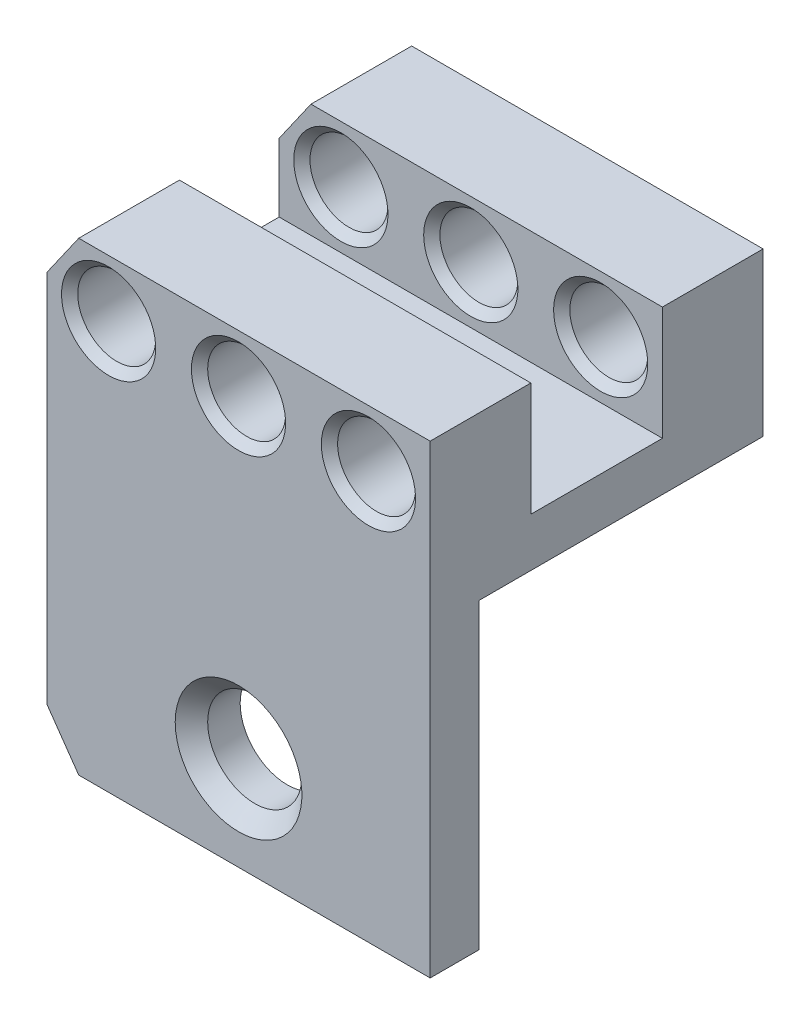
ISO-10303-21;
HEADER;
FILE_DESCRIPTION(('STEP AP214'),'2;1');
FILE_NAME('part.step','',(''),(''),'','','');
FILE_SCHEMA(('AUTOMOTIVE_DESIGN { 1 0 10303 214 1 1 1 1 }'));
ENDSEC;
DATA;
#1=APPLICATION_CONTEXT('core data for automotive mechanical design processes');
#2=APPLICATION_PROTOCOL_DEFINITION('international standard','automotive_design',2000,#1);
#3=PRODUCT_CONTEXT('',#1,'mechanical');
#4=PRODUCT('Part','Part','',(#3));
#5=PRODUCT_RELATED_PRODUCT_CATEGORY('part','',(#4));
#6=PRODUCT_DEFINITION_FORMATION('','',#4);
#7=PRODUCT_DEFINITION_CONTEXT('part definition',#1,'design');
#8=PRODUCT_DEFINITION('design','',#6,#7);
#9=PRODUCT_DEFINITION_SHAPE('','',#8);
#10=(LENGTH_UNIT() NAMED_UNIT(*) SI_UNIT(.MILLI.,.METRE.));
#11=(NAMED_UNIT(*) PLANE_ANGLE_UNIT() SI_UNIT($,.RADIAN.));
#12=(NAMED_UNIT(*) SI_UNIT($,.STERADIAN.) SOLID_ANGLE_UNIT());
#13=UNCERTAINTY_MEASURE_WITH_UNIT(LENGTH_MEASURE(1.E-05),#10,'distance_accuracy_value','');
#14=(GEOMETRIC_REPRESENTATION_CONTEXT(3) GLOBAL_UNCERTAINTY_ASSIGNED_CONTEXT((#13)) GLOBAL_UNIT_ASSIGNED_CONTEXT((#10,
#11,#12)) REPRESENTATION_CONTEXT('',''));
#15=CARTESIAN_POINT('',(0.,0.,0.));
#16=DIRECTION('',(0.,0.,1.));
#17=DIRECTION('',(1.,0.,0.));
#18=AXIS2_PLACEMENT_3D('',#15,#16,#17);
#19=CARTESIAN_POINT('',(0.,3.,0.));
#20=DIRECTION('',(0.,-1.,0.));
#21=DIRECTION('',(1.,0.,0.));
#22=AXIS2_PLACEMENT_3D('',#19,#20,#21);
#23=PLANE('',#22);
#24=DIRECTION('',(1.,0.,0.));
#25=VECTOR('',#24,1.);
#26=CARTESIAN_POINT('',(0.,3.,-11.3));
#27=LINE('',#26,#25);
#28=CARTESIAN_POINT('',(-23.6,3.,-11.3));
#29=VERTEX_POINT('',#28);
#30=CARTESIAN_POINT('',(0.,3.,-11.3));
#31=VERTEX_POINT('',#30);
#32=EDGE_CURVE('E179',#29,#31,#27,.T.);
#33=ORIENTED_EDGE('',*,*,#32,.F.);
#34=DIRECTION('',(0.,0.,1.));
#35=VECTOR('',#34,1.);
#36=CARTESIAN_POINT('',(-23.6,3.,3.));
#37=LINE('',#36,#35);
#38=CARTESIAN_POINT('',(-23.6,3.,-3.2));
#39=VERTEX_POINT('',#38);
#40=EDGE_CURVE('E206',#29,#39,#37,.T.);
#41=ORIENTED_EDGE('',*,*,#40,.T.);
#42=DIRECTION('',(-1.,0.,0.));
#43=VECTOR('',#42,1.);
#44=CARTESIAN_POINT('',(-23.6,3.,-3.2));
#45=LINE('',#44,#43);
#46=CARTESIAN_POINT('',(0.,3.,-3.2));
#47=VERTEX_POINT('',#46);
#48=EDGE_CURVE('E187',#47,#39,#45,.T.);
#49=ORIENTED_EDGE('',*,*,#48,.F.);
#50=DIRECTION('',(0.,0.,-1.));
#51=VECTOR('',#50,1.);
#52=CARTESIAN_POINT('',(0.,3.,-17.5));
#53=LINE('',#52,#51);
#54=EDGE_CURVE('E203',#47,#31,#53,.T.);
#55=ORIENTED_EDGE('',*,*,#54,.T.);
#56=EDGE_LOOP('',(#33,#41,#49,#55));
#57=FACE_BOUND('',#56,.T.);
#58=ADVANCED_FACE('F47',(#57),#23,.F.);
#59=CARTESIAN_POINT('',(0.,0.,3.));
#60=DIRECTION('',(0.,0.,-1.));
#61=DIRECTION('',(-1.,0.,0.));
#62=AXIS2_PLACEMENT_3D('',#59,#60,#61);
#63=PLANE('',#62);
#64=CARTESIAN_POINT('',(-19.8,6.5,3.));
#65=DIRECTION('',(0.,0.,-1.));
#66=DIRECTION('',(-1.,0.,0.));
#67=AXIS2_PLACEMENT_3D('',#64,#65,#66);
#68=CIRCLE('',#67,2.9);
#69=CARTESIAN_POINT('',(-22.7,6.5,3.));
#70=VERTEX_POINT('',#69);
#71=EDGE_CURVE('E11',#70,#70,#68,.T.);
#72=ORIENTED_EDGE('',*,*,#71,.T.);
#73=EDGE_LOOP('',(#72));
#74=FACE_BOUND('',#73,.T.);
#75=CARTESIAN_POINT('',(-11.8,6.5,3.));
#76=DIRECTION('',(0.,0.,-1.));
#77=DIRECTION('',(-1.,0.,0.));
#78=AXIS2_PLACEMENT_3D('',#75,#76,#77);
#79=CIRCLE('',#78,2.9);
#80=CARTESIAN_POINT('',(-14.7,6.5,3.));
#81=VERTEX_POINT('',#80);
#82=EDGE_CURVE('E57',#81,#81,#79,.T.);
#83=ORIENTED_EDGE('',*,*,#82,.T.);
#84=EDGE_LOOP('',(#83));
#85=FACE_BOUND('',#84,.T.);
#86=CARTESIAN_POINT('',(-3.8,6.5,3.));
#87=DIRECTION('',(0.,0.,-1.));
#88=DIRECTION('',(-1.,0.,0.));
#89=AXIS2_PLACEMENT_3D('',#86,#87,#88);
#90=CIRCLE('',#89,2.9);
#91=CARTESIAN_POINT('',(-6.70000000000001,6.5,3.));
#92=VERTEX_POINT('',#91);
#93=EDGE_CURVE('E381',#92,#92,#90,.T.);
#94=ORIENTED_EDGE('',*,*,#93,.T.);
#95=EDGE_LOOP('',(#94));
#96=FACE_BOUND('',#95,.T.);
#97=CARTESIAN_POINT('',(-11.8,-12.8288183938243,3.));
#98=DIRECTION('',(0.,0.,-1.));
#99=DIRECTION('',(-1.,0.,0.));
#100=AXIS2_PLACEMENT_3D('',#97,#98,#99);
#101=CIRCLE('',#100,3.90000000000001);
#102=CARTESIAN_POINT('',(-15.7,-12.8288183938243,3.));
#103=VERTEX_POINT('',#102);
#104=EDGE_CURVE('E293',#103,#103,#101,.T.);
#105=ORIENTED_EDGE('',*,*,#104,.T.);
#106=EDGE_LOOP('',(#105));
#107=FACE_BOUND('',#106,.T.);
#108=DIRECTION('',(0.,-1.,0.));
#109=VECTOR('',#108,1.);
#110=CARTESIAN_POINT('',(-23.6,0.,3.));
#111=LINE('',#110,#109);
#112=CARTESIAN_POINT('',(-23.6,7.19999999999998,3.));
#113=VERTEX_POINT('',#112);
#114=CARTESIAN_POINT('',(-23.6,-15.8288183938243,3.));
#115=VERTEX_POINT('',#114);
#116=EDGE_CURVE('E233',#113,#115,#111,.T.);
#117=ORIENTED_EDGE('',*,*,#116,.T.);
#118=DIRECTION('',(-0.573576436351044,0.819152044288993,0.));
#119=VECTOR('',#118,1.);
#120=CARTESIAN_POINT('',(-21.6394188930128,-18.6288183938243,3.));
#121=LINE('',#120,#119);
#122=CARTESIAN_POINT('',(-21.6394188930128,-18.6288183938243,3.));
#123=VERTEX_POINT('',#122);
#124=EDGE_CURVE('E272',#115,#123,#121,.F.);
#125=ORIENTED_EDGE('',*,*,#124,.T.);
#126=DIRECTION('',(1.,0.,0.));
#127=VECTOR('',#126,1.);
#128=CARTESIAN_POINT('',(-23.6,-18.6288183938243,3.));
#129=LINE('',#128,#127);
#130=CARTESIAN_POINT('',(0.,-18.6288183938243,3.));
#131=VERTEX_POINT('',#130);
#132=EDGE_CURVE('E225',#123,#131,#129,.T.);
#133=ORIENTED_EDGE('',*,*,#132,.T.);
#134=DIRECTION('',(0.,1.,0.));
#135=VECTOR('',#134,1.);
#136=CARTESIAN_POINT('',(0.,-14.2564386229166,3.));
#137=LINE('',#136,#135);
#138=CARTESIAN_POINT('',(0.,10.,3.));
#139=VERTEX_POINT('',#138);
#140=EDGE_CURVE('E228',#131,#139,#137,.T.);
#141=ORIENTED_EDGE('',*,*,#140,.T.);
#142=DIRECTION('',(1.,0.,0.));
#143=VECTOR('',#142,1.);
#144=CARTESIAN_POINT('',(0.,10.,3.));
#145=LINE('',#144,#143);
#146=CARTESIAN_POINT('',(-21.6394188930128,10.,3.));
#147=VERTEX_POINT('',#146);
#148=EDGE_CURVE('E183',#147,#139,#145,.T.);
#149=ORIENTED_EDGE('',*,*,#148,.F.);
#150=DIRECTION('',(0.573576436351043,0.819152044288994,0.));
#151=VECTOR('',#150,1.);
#152=CARTESIAN_POINT('',(-21.6394188930128,10.,3.));
#153=LINE('',#152,#151);
#154=EDGE_CURVE('E269',#147,#113,#153,.F.);
#155=ORIENTED_EDGE('',*,*,#154,.T.);
#156=EDGE_LOOP('',(#117,#125,#133,#141,#149,#155));
#157=FACE_BOUND('',#156,.T.);
#158=ADVANCED_FACE('F388',(#74,#85,#96,#107,#157),#63,.F.);
#159=CARTESIAN_POINT('',(0.,0.,0.));
#160=DIRECTION('',(0.,0.,-1.));
#161=DIRECTION('',(-1.,0.,0.));
#162=AXIS2_PLACEMENT_3D('',#159,#160,#161);
#163=PLANE('',#162);
#164=DIRECTION('',(1.,0.,0.));
#165=VECTOR('',#164,1.);
#166=CARTESIAN_POINT('',(0.,-18.6288183938243,0.));
#167=LINE('',#166,#165);
#168=CARTESIAN_POINT('',(-21.6394188930128,-18.6288183938243,0.));
#169=VERTEX_POINT('',#168);
#170=CARTESIAN_POINT('',(0.,-18.6288183938243,0.));
#171=VERTEX_POINT('',#170);
#172=EDGE_CURVE('E224',#169,#171,#167,.T.);
#173=ORIENTED_EDGE('',*,*,#172,.F.);
#174=DIRECTION('',(0.573576436351044,-0.819152044288993,0.));
#175=VECTOR('',#174,1.);
#176=CARTESIAN_POINT('',(-23.2729496114614,-16.2958947543199,0.));
#177=LINE('',#176,#175);
#178=CARTESIAN_POINT('',(-23.6,-15.8288183938243,0.));
#179=VERTEX_POINT('',#178);
#180=EDGE_CURVE('E257',#169,#179,#177,.F.);
#181=ORIENTED_EDGE('',*,*,#180,.T.);
#182=DIRECTION('',(0.,-1.,0.));
#183=VECTOR('',#182,1.);
#184=CARTESIAN_POINT('',(-23.6,-14.4,0.));
#185=LINE('',#184,#183);
#186=CARTESIAN_POINT('',(-23.6,0.,0.));
#187=VERTEX_POINT('',#186);
#188=EDGE_CURVE('E229',#187,#179,#185,.T.);
#189=ORIENTED_EDGE('',*,*,#188,.F.);
#190=DIRECTION('',(-1.,0.,0.));
#191=VECTOR('',#190,1.);
#192=CARTESIAN_POINT('',(0.,0.,0.));
#193=LINE('',#192,#191);
#194=CARTESIAN_POINT('',(0.,0.,0.));
#195=VERTEX_POINT('',#194);
#196=EDGE_CURVE('E243',#195,#187,#193,.T.);
#197=ORIENTED_EDGE('',*,*,#196,.F.);
#198=DIRECTION('',(0.,1.,0.));
#199=VECTOR('',#198,1.);
#200=CARTESIAN_POINT('',(0.,-14.2564386229166,0.));
#201=LINE('',#200,#199);
#202=EDGE_CURVE('E240',#171,#195,#201,.T.);
#203=ORIENTED_EDGE('',*,*,#202,.F.);
#204=EDGE_LOOP('',(#173,#181,#189,#197,#203));
#205=FACE_BOUND('',#204,.T.);
#206=CARTESIAN_POINT('',(-11.8,-12.8288183938243,0.));
#207=DIRECTION('',(0.,0.,1.));
#208=DIRECTION('',(1.,0.,0.));
#209=AXIS2_PLACEMENT_3D('',#206,#207,#208);
#210=CIRCLE('',#209,2.9);
#211=CARTESIAN_POINT('',(-8.9,-12.8288183938243,0.));
#212=VERTEX_POINT('',#211);
#213=EDGE_CURVE('E158',#212,#212,#210,.T.);
#214=ORIENTED_EDGE('',*,*,#213,.T.);
#215=EDGE_LOOP('',(#214));
#216=FACE_BOUND('',#215,.T.);
#217=ADVANCED_FACE('F423',(#205,#216),#163,.T.);
#218=CARTESIAN_POINT('',(0.,-18.6288183938243,3.));
#219=DIRECTION('',(0.,1.,0.));
#220=DIRECTION('',(0.,0.,1.));
#221=AXIS2_PLACEMENT_3D('',#218,#219,#220);
#222=PLANE('',#221);
#223=ORIENTED_EDGE('',*,*,#132,.F.);
#224=DIRECTION('',(0.,0.,-1.));
#225=VECTOR('',#224,1.);
#226=CARTESIAN_POINT('',(-21.6394188930128,-18.6288183938243,3.));
#227=LINE('',#226,#225);
#228=EDGE_CURVE('E253',#123,#169,#227,.T.);
#229=ORIENTED_EDGE('',*,*,#228,.T.);
#230=ORIENTED_EDGE('',*,*,#172,.T.);
#231=DIRECTION('',(0.,0.,-1.));
#232=VECTOR('',#231,1.);
#233=CARTESIAN_POINT('',(0.,-18.6288183938243,3.));
#234=LINE('',#233,#232);
#235=EDGE_CURVE('E237',#131,#171,#234,.T.);
#236=ORIENTED_EDGE('',*,*,#235,.F.);
#237=EDGE_LOOP('',(#223,#229,#230,#236));
#238=FACE_BOUND('',#237,.T.);
#239=ADVANCED_FACE('F445',(#238),#222,.F.);
#240=CARTESIAN_POINT('',(0.,-14.2564386229166,3.));
#241=DIRECTION('',(-1.,0.,0.));
#242=DIRECTION('',(0.,-1.,0.));
#243=AXIS2_PLACEMENT_3D('',#240,#241,#242);
#244=PLANE('',#243);
#245=ORIENTED_EDGE('',*,*,#202,.T.);
#246=DIRECTION('',(0.,0.,-1.));
#247=VECTOR('',#246,1.);
#248=CARTESIAN_POINT('',(0.,0.,-17.5));
#249=LINE('',#248,#247);
#250=CARTESIAN_POINT('',(0.,0.,-17.5));
#251=VERTEX_POINT('',#250);
#252=EDGE_CURVE('E154',#195,#251,#249,.T.);
#253=ORIENTED_EDGE('',*,*,#252,.T.);
#254=DIRECTION('',(0.,-1.,0.));
#255=VECTOR('',#254,1.);
#256=CARTESIAN_POINT('',(0.,3.,-17.5));
#257=LINE('',#256,#255);
#258=CARTESIAN_POINT('',(0.,10.,-17.5));
#259=VERTEX_POINT('',#258);
#260=EDGE_CURVE('E148',#259,#251,#257,.T.);
#261=ORIENTED_EDGE('',*,*,#260,.F.);
#262=DIRECTION('',(0.,0.,-1.));
#263=VECTOR('',#262,1.);
#264=CARTESIAN_POINT('',(0.,10.,-17.5));
#265=LINE('',#264,#263);
#266=CARTESIAN_POINT('',(0.,10.,-11.3));
#267=VERTEX_POINT('',#266);
#268=EDGE_CURVE('E152',#267,#259,#265,.T.);
#269=ORIENTED_EDGE('',*,*,#268,.F.);
#270=DIRECTION('',(0.,-1.,0.));
#271=VECTOR('',#270,1.);
#272=CARTESIAN_POINT('',(0.,10.,-11.3));
#273=LINE('',#272,#271);
#274=EDGE_CURVE('E173',#267,#31,#273,.T.);
#275=ORIENTED_EDGE('',*,*,#274,.T.);
#276=ORIENTED_EDGE('',*,*,#54,.F.);
#277=DIRECTION('',(0.,-1.,0.));
#278=VECTOR('',#277,1.);
#279=CARTESIAN_POINT('',(0.,10.,-3.2));
#280=LINE('',#279,#278);
#281=CARTESIAN_POINT('',(0.,10.,-3.2));
#282=VERTEX_POINT('',#281);
#283=EDGE_CURVE('E199',#282,#47,#280,.T.);
#284=ORIENTED_EDGE('',*,*,#283,.F.);
#285=DIRECTION('',(0.,0.,-1.));
#286=VECTOR('',#285,1.);
#287=CARTESIAN_POINT('',(0.,10.,-3.2));
#288=LINE('',#287,#286);
#289=EDGE_CURVE('E186',#139,#282,#288,.T.);
#290=ORIENTED_EDGE('',*,*,#289,.F.);
#291=ORIENTED_EDGE('',*,*,#140,.F.);
#292=ORIENTED_EDGE('',*,*,#235,.T.);
#293=EDGE_LOOP('',(#245,#253,#261,#269,#275,#276,#284,#290,#291,#292));
#294=FACE_BOUND('',#293,.T.);
#295=ADVANCED_FACE('F150',(#294),#244,.F.);
#296=CARTESIAN_POINT('',(-23.6,-14.4,3.));
#297=DIRECTION('',(1.,0.,0.));
#298=DIRECTION('',(0.,0.,-1.));
#299=AXIS2_PLACEMENT_3D('',#296,#297,#298);
#300=PLANE('',#299);
#301=ORIENTED_EDGE('',*,*,#188,.T.);
#302=DIRECTION('',(0.,0.,1.));
#303=VECTOR('',#302,1.);
#304=CARTESIAN_POINT('',(-23.6,-15.8288183938243,3.));
#305=LINE('',#304,#303);
#306=EDGE_CURVE('E266',#179,#115,#305,.T.);
#307=ORIENTED_EDGE('',*,*,#306,.T.);
#308=ORIENTED_EDGE('',*,*,#116,.F.);
#309=DIRECTION('',(0.,0.,-1.));
#310=VECTOR('',#309,1.);
#311=CARTESIAN_POINT('',(-23.6,7.19999999999998,3.));
#312=LINE('',#311,#310);
#313=CARTESIAN_POINT('',(-23.6,7.19999999999998,-3.2));
#314=VERTEX_POINT('',#313);
#315=EDGE_CURVE('E260',#113,#314,#312,.T.);
#316=ORIENTED_EDGE('',*,*,#315,.T.);
#317=DIRECTION('',(0.,-1.,0.));
#318=VECTOR('',#317,1.);
#319=CARTESIAN_POINT('',(-23.6,10.,-3.2));
#320=LINE('',#319,#318);
#321=EDGE_CURVE('E193',#314,#39,#320,.T.);
#322=ORIENTED_EDGE('',*,*,#321,.T.);
#323=ORIENTED_EDGE('',*,*,#40,.F.);
#324=DIRECTION('',(0.,-1.,0.));
#325=VECTOR('',#324,1.);
#326=CARTESIAN_POINT('',(-23.6,10.,-11.3));
#327=LINE('',#326,#325);
#328=CARTESIAN_POINT('',(-23.6,7.19999999999998,-11.3));
#329=VERTEX_POINT('',#328);
#330=EDGE_CURVE('E176',#329,#29,#327,.T.);
#331=ORIENTED_EDGE('',*,*,#330,.F.);
#332=DIRECTION('',(0.,0.,-1.));
#333=VECTOR('',#332,1.);
#334=CARTESIAN_POINT('',(-23.6,7.19999999999998,3.));
#335=LINE('',#334,#333);
#336=CARTESIAN_POINT('',(-23.6,7.19999999999998,-17.5));
#337=VERTEX_POINT('',#336);
#338=EDGE_CURVE('E263',#329,#337,#335,.T.);
#339=ORIENTED_EDGE('',*,*,#338,.T.);
#340=DIRECTION('',(0.,-1.,0.));
#341=VECTOR('',#340,1.);
#342=CARTESIAN_POINT('',(-23.6,3.,-17.5));
#343=LINE('',#342,#341);
#344=CARTESIAN_POINT('',(-23.6,0.,-17.5));
#345=VERTEX_POINT('',#344);
#346=EDGE_CURVE('E159',#337,#345,#343,.T.);
#347=ORIENTED_EDGE('',*,*,#346,.T.);
#348=DIRECTION('',(0.,0.,1.));
#349=VECTOR('',#348,1.);
#350=CARTESIAN_POINT('',(-23.6,0.,3.));
#351=LINE('',#350,#349);
#352=EDGE_CURVE('E207',#345,#187,#351,.T.);
#353=ORIENTED_EDGE('',*,*,#352,.T.);
#354=EDGE_LOOP('',(#301,#307,#308,#316,#322,#323,#331,#339,#347,#353));
#355=FACE_BOUND('',#354,.T.);
#356=ADVANCED_FACE('F440',(#355),#300,.F.);
#357=CARTESIAN_POINT('',(-11.8,-12.8288183938243,3.));
#358=DIRECTION('',(0.,0.,-1.));
#359=DIRECTION('',(-1.,0.,0.));
#360=AXIS2_PLACEMENT_3D('',#357,#358,#359);
#361=CYLINDRICAL_SURFACE('',#360,2.9);
#362=CARTESIAN_POINT('',(-11.8,-12.8288183938243,1.99999999999999));
#363=DIRECTION('',(0.,0.,-1.));
#364=DIRECTION('',(-1.,0.,0.));
#365=AXIS2_PLACEMENT_3D('',#362,#363,#364);
#366=CIRCLE('',#365,2.9);
#367=CARTESIAN_POINT('',(-14.7,-12.8288183938243,1.99999999999999));
#368=VERTEX_POINT('',#367);
#369=EDGE_CURVE('E289',#368,#368,#366,.F.);
#370=ORIENTED_EDGE('',*,*,#369,.T.);
#371=EDGE_LOOP('',(#370));
#372=FACE_BOUND('',#371,.T.);
#373=ORIENTED_EDGE('',*,*,#213,.F.);
#374=EDGE_LOOP('',(#373));
#375=FACE_BOUND('',#374,.T.);
#376=ADVANCED_FACE('F437',(#372,#375),#361,.F.);
#377=CARTESIAN_POINT('',(-23.6,3.,-17.5));
#378=DIRECTION('',(0.,0.,1.));
#379=DIRECTION('',(1.,0.,0.));
#380=AXIS2_PLACEMENT_3D('',#377,#378,#379);
#381=PLANE('',#380);
#382=CARTESIAN_POINT('',(-19.8,6.5,-17.5));
#383=DIRECTION('',(0.,0.,1.));
#384=DIRECTION('',(1.,0.,0.));
#385=AXIS2_PLACEMENT_3D('',#382,#383,#384);
#386=CIRCLE('',#385,2.9);
#387=CARTESIAN_POINT('',(-16.9,6.5,-17.5));
#388=VERTEX_POINT('',#387);
#389=EDGE_CURVE('E377',#388,#388,#386,.T.);
#390=ORIENTED_EDGE('',*,*,#389,.T.);
#391=EDGE_LOOP('',(#390));
#392=FACE_BOUND('',#391,.T.);
#393=CARTESIAN_POINT('',(-11.8,6.5,-17.5));
#394=DIRECTION('',(0.,0.,1.));
#395=DIRECTION('',(1.,0.,0.));
#396=AXIS2_PLACEMENT_3D('',#393,#394,#395);
#397=CIRCLE('',#396,2.9);
#398=CARTESIAN_POINT('',(-8.90000000000001,6.5,-17.5));
#399=VERTEX_POINT('',#398);
#400=EDGE_CURVE('E373',#399,#399,#397,.T.);
#401=ORIENTED_EDGE('',*,*,#400,.T.);
#402=EDGE_LOOP('',(#401));
#403=FACE_BOUND('',#402,.T.);
#404=CARTESIAN_POINT('',(-3.8,6.5,-17.5));
#405=DIRECTION('',(0.,0.,1.));
#406=DIRECTION('',(1.,0.,0.));
#407=AXIS2_PLACEMENT_3D('',#404,#405,#406);
#408=CIRCLE('',#407,2.9);
#409=CARTESIAN_POINT('',(-0.900000000000005,6.5,-17.5));
#410=VERTEX_POINT('',#409);
#411=EDGE_CURVE('E369',#410,#410,#408,.T.);
#412=ORIENTED_EDGE('',*,*,#411,.T.);
#413=EDGE_LOOP('',(#412));
#414=FACE_BOUND('',#413,.T.);
#415=ORIENTED_EDGE('',*,*,#346,.F.);
#416=DIRECTION('',(-0.573576436351043,-0.819152044288994,0.));
#417=VECTOR('',#416,1.);
#418=CARTESIAN_POINT('',(-21.6394188930128,10.,-17.5));
#419=LINE('',#418,#417);
#420=CARTESIAN_POINT('',(-21.6394188930128,10.,-17.5));
#421=VERTEX_POINT('',#420);
#422=EDGE_CURVE('E72',#337,#421,#419,.F.);
#423=ORIENTED_EDGE('',*,*,#422,.T.);
#424=DIRECTION('',(-1.,0.,0.));
#425=VECTOR('',#424,1.);
#426=CARTESIAN_POINT('',(-23.6,10.,-17.5));
#427=LINE('',#426,#425);
#428=EDGE_CURVE('E164',#259,#421,#427,.T.);
#429=ORIENTED_EDGE('',*,*,#428,.F.);
#430=ORIENTED_EDGE('',*,*,#260,.T.);
#431=DIRECTION('',(-1.,0.,0.));
#432=VECTOR('',#431,1.);
#433=CARTESIAN_POINT('',(-23.6,0.,-17.5));
#434=LINE('',#433,#432);
#435=EDGE_CURVE('E213',#251,#345,#434,.T.);
#436=ORIENTED_EDGE('',*,*,#435,.T.);
#437=EDGE_LOOP('',(#415,#423,#429,#430,#436));
#438=FACE_BOUND('',#437,.T.);
#439=ADVANCED_FACE('F171',(#392,#403,#414,#438),#381,.F.);
#440=CARTESIAN_POINT('',(0.,0.,0.));
#441=DIRECTION('',(0.,-1.,0.));
#442=DIRECTION('',(1.,0.,0.));
#443=AXIS2_PLACEMENT_3D('',#440,#441,#442);
#444=PLANE('',#443);
#445=ORIENTED_EDGE('',*,*,#252,.F.);
#446=ORIENTED_EDGE('',*,*,#196,.T.);
#447=ORIENTED_EDGE('',*,*,#352,.F.);
#448=ORIENTED_EDGE('',*,*,#435,.F.);
#449=EDGE_LOOP('',(#445,#446,#447,#448));
#450=FACE_BOUND('',#449,.T.);
#451=ADVANCED_FACE('F431',(#450),#444,.T.);
#452=CARTESIAN_POINT('',(-23.6,10.,-3.2));
#453=DIRECTION('',(0.,0.,1.));
#454=DIRECTION('',(1.,0.,0.));
#455=AXIS2_PLACEMENT_3D('',#452,#453,#454);
#456=PLANE('',#455);
#457=CARTESIAN_POINT('',(-19.8,6.5,-3.2));
#458=DIRECTION('',(0.,0.,1.));
#459=DIRECTION('',(1.,0.,0.));
#460=AXIS2_PLACEMENT_3D('',#457,#458,#459);
#461=CIRCLE('',#460,2.90000000000001);
#462=CARTESIAN_POINT('',(-16.9,6.5,-3.2));
#463=VERTEX_POINT('',#462);
#464=EDGE_CURVE('E305',#463,#463,#461,.T.);
#465=ORIENTED_EDGE('',*,*,#464,.T.);
#466=EDGE_LOOP('',(#465));
#467=FACE_BOUND('',#466,.T.);
#468=CARTESIAN_POINT('',(-11.8,6.5,-3.2));
#469=DIRECTION('',(0.,0.,1.));
#470=DIRECTION('',(1.,0.,0.));
#471=AXIS2_PLACEMENT_3D('',#468,#469,#470);
#472=CIRCLE('',#471,2.9);
#473=CARTESIAN_POINT('',(-8.90000000000001,6.5,-3.2));
#474=VERTEX_POINT('',#473);
#475=EDGE_CURVE('E301',#474,#474,#472,.T.);
#476=ORIENTED_EDGE('',*,*,#475,.T.);
#477=EDGE_LOOP('',(#476));
#478=FACE_BOUND('',#477,.T.);
#479=CARTESIAN_POINT('',(-3.8,6.5,-3.2));
#480=DIRECTION('',(0.,0.,1.));
#481=DIRECTION('',(1.,0.,0.));
#482=AXIS2_PLACEMENT_3D('',#479,#480,#481);
#483=CIRCLE('',#482,2.9);
#484=CARTESIAN_POINT('',(-0.900000000000005,6.5,-3.2));
#485=VERTEX_POINT('',#484);
#486=EDGE_CURVE('E297',#485,#485,#483,.T.);
#487=ORIENTED_EDGE('',*,*,#486,.T.);
#488=EDGE_LOOP('',(#487));
#489=FACE_BOUND('',#488,.T.);
#490=ORIENTED_EDGE('',*,*,#321,.F.);
#491=DIRECTION('',(-0.573576436351043,-0.819152044288994,0.));
#492=VECTOR('',#491,1.);
#493=CARTESIAN_POINT('',(-21.6394188930128,10.,-3.2));
#494=LINE('',#493,#492);
#495=CARTESIAN_POINT('',(-21.6394188930128,10.,-3.2));
#496=VERTEX_POINT('',#495);
#497=EDGE_CURVE('E64',#314,#496,#494,.F.);
#498=ORIENTED_EDGE('',*,*,#497,.T.);
#499=DIRECTION('',(-1.,0.,0.));
#500=VECTOR('',#499,1.);
#501=CARTESIAN_POINT('',(-23.6,10.,-3.2));
#502=LINE('',#501,#500);
#503=EDGE_CURVE('E190',#282,#496,#502,.T.);
#504=ORIENTED_EDGE('',*,*,#503,.F.);
#505=ORIENTED_EDGE('',*,*,#283,.T.);
#506=ORIENTED_EDGE('',*,*,#48,.T.);
#507=EDGE_LOOP('',(#490,#498,#504,#505,#506));
#508=FACE_BOUND('',#507,.T.);
#509=ADVANCED_FACE('F429',(#467,#478,#489,#508),#456,.F.);
#510=CARTESIAN_POINT('',(0.,10.,0.));
#511=DIRECTION('',(0.,-1.,0.));
#512=DIRECTION('',(1.,0.,0.));
#513=AXIS2_PLACEMENT_3D('',#510,#511,#512);
#514=PLANE('',#513);
#515=ORIENTED_EDGE('',*,*,#503,.T.);
#516=DIRECTION('',(0.,0.,1.));
#517=VECTOR('',#516,1.);
#518=CARTESIAN_POINT('',(-21.6394188930128,10.,0.));
#519=LINE('',#518,#517);
#520=EDGE_CURVE('E283',#496,#147,#519,.T.);
#521=ORIENTED_EDGE('',*,*,#520,.T.);
#522=ORIENTED_EDGE('',*,*,#148,.T.);
#523=ORIENTED_EDGE('',*,*,#289,.T.);
#524=EDGE_LOOP('',(#515,#521,#522,#523));
#525=FACE_BOUND('',#524,.T.);
#526=ADVANCED_FACE('F743',(#525),#514,.F.);
#527=CARTESIAN_POINT('',(0.,10.,-11.3));
#528=DIRECTION('',(0.,0.,-1.));
#529=DIRECTION('',(-1.,0.,0.));
#530=AXIS2_PLACEMENT_3D('',#527,#528,#529);
#531=PLANE('',#530);
#532=CARTESIAN_POINT('',(-19.8,6.5,-11.3));
#533=DIRECTION('',(0.,0.,-1.));
#534=DIRECTION('',(-1.,0.,0.));
#535=AXIS2_PLACEMENT_3D('',#532,#533,#534);
#536=CIRCLE('',#535,2.9);
#537=CARTESIAN_POINT('',(-22.7,6.5,-11.3));
#538=VERTEX_POINT('',#537);
#539=EDGE_CURVE('E341',#538,#538,#536,.T.);
#540=ORIENTED_EDGE('',*,*,#539,.T.);
#541=EDGE_LOOP('',(#540));
#542=FACE_BOUND('',#541,.T.);
#543=CARTESIAN_POINT('',(-11.8,6.5,-11.3));
#544=DIRECTION('',(0.,0.,-1.));
#545=DIRECTION('',(-1.,0.,0.));
#546=AXIS2_PLACEMENT_3D('',#543,#544,#545);
#547=CIRCLE('',#546,2.9);
#548=CARTESIAN_POINT('',(-14.7,6.5,-11.3));
#549=VERTEX_POINT('',#548);
#550=EDGE_CURVE('E337',#549,#549,#547,.T.);
#551=ORIENTED_EDGE('',*,*,#550,.T.);
#552=EDGE_LOOP('',(#551));
#553=FACE_BOUND('',#552,.T.);
#554=CARTESIAN_POINT('',(-3.8,6.5,-11.3));
#555=DIRECTION('',(0.,0.,-1.));
#556=DIRECTION('',(-1.,0.,0.));
#557=AXIS2_PLACEMENT_3D('',#554,#555,#556);
#558=CIRCLE('',#557,2.9);
#559=CARTESIAN_POINT('',(-6.7,6.5,-11.3));
#560=VERTEX_POINT('',#559);
#561=EDGE_CURVE('E333',#560,#560,#558,.T.);
#562=ORIENTED_EDGE('',*,*,#561,.T.);
#563=EDGE_LOOP('',(#562));
#564=FACE_BOUND('',#563,.T.);
#565=DIRECTION('',(1.,0.,0.));
#566=VECTOR('',#565,1.);
#567=CARTESIAN_POINT('',(0.,10.,-11.3));
#568=LINE('',#567,#566);
#569=CARTESIAN_POINT('',(-21.6394188930128,10.,-11.3));
#570=VERTEX_POINT('',#569);
#571=EDGE_CURVE('E167',#570,#267,#568,.T.);
#572=ORIENTED_EDGE('',*,*,#571,.F.);
#573=DIRECTION('',(0.573576436351043,0.819152044288994,0.));
#574=VECTOR('',#573,1.);
#575=CARTESIAN_POINT('',(-21.6394188930128,10.,-11.3));
#576=LINE('',#575,#574);
#577=EDGE_CURVE('E278',#570,#329,#576,.F.);
#578=ORIENTED_EDGE('',*,*,#577,.T.);
#579=ORIENTED_EDGE('',*,*,#330,.T.);
#580=ORIENTED_EDGE('',*,*,#32,.T.);
#581=ORIENTED_EDGE('',*,*,#274,.F.);
#582=EDGE_LOOP('',(#572,#578,#579,#580,#581));
#583=FACE_BOUND('',#582,.T.);
#584=ADVANCED_FACE('F733',(#542,#553,#564,#583),#531,.F.);
#585=CARTESIAN_POINT('',(0.,10.,0.));
#586=DIRECTION('',(0.,-1.,0.));
#587=DIRECTION('',(1.,0.,0.));
#588=AXIS2_PLACEMENT_3D('',#585,#586,#587);
#589=PLANE('',#588);
#590=ORIENTED_EDGE('',*,*,#428,.T.);
#591=DIRECTION('',(0.,0.,1.));
#592=VECTOR('',#591,1.);
#593=CARTESIAN_POINT('',(-21.6394188930128,10.,0.));
#594=LINE('',#593,#592);
#595=EDGE_CURVE('E275',#421,#570,#594,.T.);
#596=ORIENTED_EDGE('',*,*,#595,.T.);
#597=ORIENTED_EDGE('',*,*,#571,.T.);
#598=ORIENTED_EDGE('',*,*,#268,.T.);
#599=EDGE_LOOP('',(#590,#596,#597,#598));
#600=FACE_BOUND('',#599,.T.);
#601=ADVANCED_FACE('F162',(#600),#589,.F.);
#602=CARTESIAN_POINT('',(-11.8,6.5,-17.5));
#603=DIRECTION('',(0.,0.,1.));
#604=DIRECTION('',(1.,0.,0.));
#605=AXIS2_PLACEMENT_3D('',#602,#603,#604);
#606=CYLINDRICAL_SURFACE('',#605,2.4);
#607=CARTESIAN_POINT('',(-11.8,6.5,-11.8));
#608=DIRECTION('',(0.,0.,-1.));
#609=DIRECTION('',(-1.,0.,0.));
#610=AXIS2_PLACEMENT_3D('',#607,#608,#609);
#611=CIRCLE('',#610,2.4);
#612=CARTESIAN_POINT('',(-14.2,6.5,-11.8));
#613=VERTEX_POINT('',#612);
#614=EDGE_CURVE('E357',#613,#613,#611,.F.);
#615=ORIENTED_EDGE('',*,*,#614,.T.);
#616=EDGE_LOOP('',(#615));
#617=FACE_BOUND('',#616,.T.);
#618=CARTESIAN_POINT('',(-11.8,6.5,-17.));
#619=DIRECTION('',(0.,0.,1.));
#620=DIRECTION('',(1.,0.,0.));
#621=AXIS2_PLACEMENT_3D('',#618,#619,#620);
#622=CIRCLE('',#621,2.4);
#623=CARTESIAN_POINT('',(-9.4,6.5,-17.));
#624=VERTEX_POINT('',#623);
#625=EDGE_CURVE('E353',#624,#624,#622,.F.);
#626=ORIENTED_EDGE('',*,*,#625,.T.);
#627=EDGE_LOOP('',(#626));
#628=FACE_BOUND('',#627,.T.);
#629=ADVANCED_FACE('F403',(#617,#628),#606,.F.);
#630=CARTESIAN_POINT('',(-19.8,6.5,-17.5));
#631=DIRECTION('',(0.,0.,1.));
#632=DIRECTION('',(1.,0.,0.));
#633=AXIS2_PLACEMENT_3D('',#630,#631,#632);
#634=CYLINDRICAL_SURFACE('',#633,2.4);
#635=CARTESIAN_POINT('',(-19.8,6.5,-11.8));
#636=DIRECTION('',(0.,0.,-1.));
#637=DIRECTION('',(-1.,0.,0.));
#638=AXIS2_PLACEMENT_3D('',#635,#636,#637);
#639=CIRCLE('',#638,2.4);
#640=CARTESIAN_POINT('',(-22.2,6.5,-11.8));
#641=VERTEX_POINT('',#640);
#642=EDGE_CURVE('E349',#641,#641,#639,.F.);
#643=ORIENTED_EDGE('',*,*,#642,.T.);
#644=EDGE_LOOP('',(#643));
#645=FACE_BOUND('',#644,.T.);
#646=CARTESIAN_POINT('',(-19.8,6.5,-17.));
#647=DIRECTION('',(0.,0.,1.));
#648=DIRECTION('',(1.,0.,0.));
#649=AXIS2_PLACEMENT_3D('',#646,#647,#648);
#650=CIRCLE('',#649,2.4);
#651=CARTESIAN_POINT('',(-17.4,6.5,-17.));
#652=VERTEX_POINT('',#651);
#653=EDGE_CURVE('E345',#652,#652,#650,.F.);
#654=ORIENTED_EDGE('',*,*,#653,.T.);
#655=EDGE_LOOP('',(#654));
#656=FACE_BOUND('',#655,.T.);
#657=ADVANCED_FACE('F411',(#645,#656),#634,.F.);
#658=CARTESIAN_POINT('',(-3.8,6.5,-17.5));
#659=DIRECTION('',(0.,0.,1.));
#660=DIRECTION('',(1.,0.,0.));
#661=AXIS2_PLACEMENT_3D('',#658,#659,#660);
#662=CYLINDRICAL_SURFACE('',#661,2.4);
#663=CARTESIAN_POINT('',(-3.8,6.5,-11.8));
#664=DIRECTION('',(0.,0.,-1.));
#665=DIRECTION('',(-1.,0.,0.));
#666=AXIS2_PLACEMENT_3D('',#663,#664,#665);
#667=CIRCLE('',#666,2.4);
#668=CARTESIAN_POINT('',(-6.2,6.5,-11.8));
#669=VERTEX_POINT('',#668);
#670=EDGE_CURVE('E365',#669,#669,#667,.F.);
#671=ORIENTED_EDGE('',*,*,#670,.T.);
#672=EDGE_LOOP('',(#671));
#673=FACE_BOUND('',#672,.T.);
#674=CARTESIAN_POINT('',(-3.8,6.5,-17.));
#675=DIRECTION('',(0.,0.,1.));
#676=DIRECTION('',(1.,0.,0.));
#677=AXIS2_PLACEMENT_3D('',#674,#675,#676);
#678=CIRCLE('',#677,2.4);
#679=CARTESIAN_POINT('',(-1.4,6.5,-17.));
#680=VERTEX_POINT('',#679);
#681=EDGE_CURVE('E361',#680,#680,#678,.F.);
#682=ORIENTED_EDGE('',*,*,#681,.T.);
#683=EDGE_LOOP('',(#682));
#684=FACE_BOUND('',#683,.T.);
#685=ADVANCED_FACE('F400',(#673,#684),#662,.F.);
#686=CARTESIAN_POINT('',(-11.8,6.5,-2.7));
#687=DIRECTION('',(0.,0.,1.));
#688=DIRECTION('',(1.,0.,0.));
#689=AXIS2_PLACEMENT_3D('',#686,#687,#688);
#690=CIRCLE('',#689,2.4);
#691=CARTESIAN_POINT('',(-9.4,6.5,-2.7));
#692=VERTEX_POINT('',#691);
#693=EDGE_CURVE('E321',#692,#692,#690,.F.);
#694=ORIENTED_EDGE('',*,*,#693,.T.);
#695=EDGE_LOOP('',(#694));
#696=FACE_BOUND('',#695,.T.);
#697=CARTESIAN_POINT('',(-11.8,6.5,2.5));
#698=DIRECTION('',(0.,0.,-1.));
#699=DIRECTION('',(-1.,0.,0.));
#700=AXIS2_PLACEMENT_3D('',#697,#698,#699);
#701=CIRCLE('',#700,2.4);
#702=CARTESIAN_POINT('',(-14.2,6.5,2.5));
#703=VERTEX_POINT('',#702);
#704=EDGE_CURVE('E317',#703,#703,#701,.F.);
#705=ORIENTED_EDGE('',*,*,#704,.T.);
#706=EDGE_LOOP('',(#705));
#707=FACE_BOUND('',#706,.T.);
#708=ADVANCED_FACE('F397',(#696,#707),#606,.F.);
#709=CARTESIAN_POINT('',(-19.8,6.5,-2.69999999999999));
#710=DIRECTION('',(0.,0.,1.));
#711=DIRECTION('',(1.,0.,0.));
#712=AXIS2_PLACEMENT_3D('',#709,#710,#711);
#713=CIRCLE('',#712,2.4);
#714=CARTESIAN_POINT('',(-17.4,6.5,-2.69999999999999));
#715=VERTEX_POINT('',#714);
#716=EDGE_CURVE('E313',#715,#715,#713,.F.);
#717=ORIENTED_EDGE('',*,*,#716,.T.);
#718=EDGE_LOOP('',(#717));
#719=FACE_BOUND('',#718,.T.);
#720=CARTESIAN_POINT('',(-19.8,6.5,2.5));
#721=DIRECTION('',(0.,0.,-1.));
#722=DIRECTION('',(-1.,0.,0.));
#723=AXIS2_PLACEMENT_3D('',#720,#721,#722);
#724=CIRCLE('',#723,2.4);
#725=CARTESIAN_POINT('',(-22.2,6.5,2.5));
#726=VERTEX_POINT('',#725);
#727=EDGE_CURVE('E309',#726,#726,#724,.F.);
#728=ORIENTED_EDGE('',*,*,#727,.T.);
#729=EDGE_LOOP('',(#728));
#730=FACE_BOUND('',#729,.T.);
#731=ADVANCED_FACE('F399',(#719,#730),#634,.F.);
#732=CARTESIAN_POINT('',(-3.8,6.5,-2.7));
#733=DIRECTION('',(0.,0.,1.));
#734=DIRECTION('',(1.,0.,0.));
#735=AXIS2_PLACEMENT_3D('',#732,#733,#734);
#736=CIRCLE('',#735,2.4);
#737=CARTESIAN_POINT('',(-1.4,6.5,-2.7));
#738=VERTEX_POINT('',#737);
#739=EDGE_CURVE('E329',#738,#738,#736,.F.);
#740=ORIENTED_EDGE('',*,*,#739,.T.);
#741=EDGE_LOOP('',(#740));
#742=FACE_BOUND('',#741,.T.);
#743=CARTESIAN_POINT('',(-3.8,6.5,2.5));
#744=DIRECTION('',(0.,0.,-1.));
#745=DIRECTION('',(-1.,0.,0.));
#746=AXIS2_PLACEMENT_3D('',#743,#744,#745);
#747=CIRCLE('',#746,2.4);
#748=CARTESIAN_POINT('',(-6.2,6.5,2.5));
#749=VERTEX_POINT('',#748);
#750=EDGE_CURVE('E325',#749,#749,#747,.F.);
#751=ORIENTED_EDGE('',*,*,#750,.T.);
#752=EDGE_LOOP('',(#751));
#753=FACE_BOUND('',#752,.T.);
#754=ADVANCED_FACE('F408',(#742,#753),#662,.F.);
#755=CARTESIAN_POINT('',(-21.6394188930128,-18.6288183938243,3.));
#756=DIRECTION('',(0.819152044288993,0.573576436351044,0.));
#757=DIRECTION('',(0.,0.,-1.));
#758=AXIS2_PLACEMENT_3D('',#755,#756,#757);
#759=PLANE('',#758);
#760=ORIENTED_EDGE('',*,*,#124,.F.);
#761=ORIENTED_EDGE('',*,*,#306,.F.);
#762=ORIENTED_EDGE('',*,*,#180,.F.);
#763=ORIENTED_EDGE('',*,*,#228,.F.);
#764=EDGE_LOOP('',(#760,#761,#762,#763));
#765=FACE_BOUND('',#764,.T.);
#766=ADVANCED_FACE('F456',(#765),#759,.F.);
#767=CARTESIAN_POINT('',(-21.6394188930128,10.,0.));
#768=DIRECTION('',(0.819152044288994,-0.573576436351043,0.));
#769=DIRECTION('',(0.,0.,1.));
#770=AXIS2_PLACEMENT_3D('',#767,#768,#769);
#771=PLANE('',#770);
#772=ORIENTED_EDGE('',*,*,#422,.F.);
#773=ORIENTED_EDGE('',*,*,#338,.F.);
#774=ORIENTED_EDGE('',*,*,#577,.F.);
#775=ORIENTED_EDGE('',*,*,#595,.F.);
#776=EDGE_LOOP('',(#772,#773,#774,#775));
#777=FACE_BOUND('',#776,.T.);
#778=ADVANCED_FACE('F462',(#777),#771,.F.);
#779=CARTESIAN_POINT('',(-21.6394188930128,10.,0.));
#780=DIRECTION('',(0.819152044288994,-0.573576436351043,0.));
#781=DIRECTION('',(0.,0.,1.));
#782=AXIS2_PLACEMENT_3D('',#779,#780,#781);
#783=PLANE('',#782);
#784=ORIENTED_EDGE('',*,*,#497,.F.);
#785=ORIENTED_EDGE('',*,*,#315,.F.);
#786=ORIENTED_EDGE('',*,*,#154,.F.);
#787=ORIENTED_EDGE('',*,*,#520,.F.);
#788=EDGE_LOOP('',(#784,#785,#786,#787));
#789=FACE_BOUND('',#788,.T.);
#790=ADVANCED_FACE('F469',(#789),#783,.F.);
#791=CARTESIAN_POINT('',(-11.8,-12.8288183938243,1.99999999999999));
#792=DIRECTION('',(0.,0.,1.));
#793=DIRECTION('',(1.,0.,0.));
#794=AXIS2_PLACEMENT_3D('',#791,#792,#793);
#795=CONICAL_SURFACE('',#794,2.9,0.78539816339745);
#796=ORIENTED_EDGE('',*,*,#104,.F.);
#797=EDGE_LOOP('',(#796));
#798=FACE_BOUND('',#797,.T.);
#799=ORIENTED_EDGE('',*,*,#369,.F.);
#800=EDGE_LOOP('',(#799));
#801=FACE_BOUND('',#800,.T.);
#802=ADVANCED_FACE('F476',(#798,#801),#795,.F.);
#803=CARTESIAN_POINT('',(-19.8,6.5,-3.2));
#804=DIRECTION('',(0.,0.,-1.));
#805=DIRECTION('',(-1.,0.,0.));
#806=AXIS2_PLACEMENT_3D('',#803,#804,#805);
#807=CONICAL_SURFACE('',#806,2.90000000000001,0.785398163397442);
#808=ORIENTED_EDGE('',*,*,#716,.F.);
#809=EDGE_LOOP('',(#808));
#810=FACE_BOUND('',#809,.T.);
#811=ORIENTED_EDGE('',*,*,#464,.F.);
#812=EDGE_LOOP('',(#811));
#813=FACE_BOUND('',#812,.T.);
#814=ADVANCED_FACE('F483',(#810,#813),#807,.F.);
#815=CARTESIAN_POINT('',(-11.8,6.5,-3.2));
#816=DIRECTION('',(0.,0.,-1.));
#817=DIRECTION('',(-1.,0.,0.));
#818=AXIS2_PLACEMENT_3D('',#815,#816,#817);
#819=CONICAL_SURFACE('',#818,2.9,0.785398163397445);
#820=ORIENTED_EDGE('',*,*,#693,.F.);
#821=EDGE_LOOP('',(#820));
#822=FACE_BOUND('',#821,.T.);
#823=ORIENTED_EDGE('',*,*,#475,.F.);
#824=EDGE_LOOP('',(#823));
#825=FACE_BOUND('',#824,.T.);
#826=ADVANCED_FACE('F490',(#822,#825),#819,.F.);
#827=CARTESIAN_POINT('',(-3.8,6.5,-3.2));
#828=DIRECTION('',(0.,0.,-1.));
#829=DIRECTION('',(-1.,0.,0.));
#830=AXIS2_PLACEMENT_3D('',#827,#828,#829);
#831=CONICAL_SURFACE('',#830,2.9,0.785398163397446);
#832=ORIENTED_EDGE('',*,*,#739,.F.);
#833=EDGE_LOOP('',(#832));
#834=FACE_BOUND('',#833,.T.);
#835=ORIENTED_EDGE('',*,*,#486,.F.);
#836=EDGE_LOOP('',(#835));
#837=FACE_BOUND('',#836,.T.);
#838=ADVANCED_FACE('F497',(#834,#837),#831,.F.);
#839=CARTESIAN_POINT('',(-19.8,6.5,-11.3));
#840=DIRECTION('',(0.,0.,1.));
#841=DIRECTION('',(1.,0.,0.));
#842=AXIS2_PLACEMENT_3D('',#839,#840,#841);
#843=CONICAL_SURFACE('',#842,2.9,0.78539816339744);
#844=ORIENTED_EDGE('',*,*,#642,.F.);
#845=EDGE_LOOP('',(#844));
#846=FACE_BOUND('',#845,.T.);
#847=ORIENTED_EDGE('',*,*,#539,.F.);
#848=EDGE_LOOP('',(#847));
#849=FACE_BOUND('',#848,.T.);
#850=ADVANCED_FACE('F504',(#846,#849),#843,.F.);
#851=CARTESIAN_POINT('',(-11.8,6.5,-11.3));
#852=DIRECTION('',(0.,0.,1.));
#853=DIRECTION('',(1.,0.,0.));
#854=AXIS2_PLACEMENT_3D('',#851,#852,#853);
#855=CONICAL_SURFACE('',#854,2.9,0.785398163397447);
#856=ORIENTED_EDGE('',*,*,#614,.F.);
#857=EDGE_LOOP('',(#856));
#858=FACE_BOUND('',#857,.T.);
#859=ORIENTED_EDGE('',*,*,#550,.F.);
#860=EDGE_LOOP('',(#859));
#861=FACE_BOUND('',#860,.T.);
#862=ADVANCED_FACE('F511',(#858,#861),#855,.F.);
#863=CARTESIAN_POINT('',(-3.8,6.5,-11.3));
#864=DIRECTION('',(0.,0.,1.));
#865=DIRECTION('',(1.,0.,0.));
#866=AXIS2_PLACEMENT_3D('',#863,#864,#865);
#867=CONICAL_SURFACE('',#866,2.9,0.785398163397448);
#868=ORIENTED_EDGE('',*,*,#670,.F.);
#869=EDGE_LOOP('',(#868));
#870=FACE_BOUND('',#869,.T.);
#871=ORIENTED_EDGE('',*,*,#561,.F.);
#872=EDGE_LOOP('',(#871));
#873=FACE_BOUND('',#872,.T.);
#874=ADVANCED_FACE('F518',(#870,#873),#867,.F.);
#875=CARTESIAN_POINT('',(-19.8,6.5,-17.5));
#876=DIRECTION('',(0.,0.,-1.));
#877=DIRECTION('',(-1.,0.,0.));
#878=AXIS2_PLACEMENT_3D('',#875,#876,#877);
#879=CONICAL_SURFACE('',#878,2.9,0.785398163397444);
#880=ORIENTED_EDGE('',*,*,#653,.F.);
#881=EDGE_LOOP('',(#880));
#882=FACE_BOUND('',#881,.T.);
#883=ORIENTED_EDGE('',*,*,#389,.F.);
#884=EDGE_LOOP('',(#883));
#885=FACE_BOUND('',#884,.T.);
#886=ADVANCED_FACE('F525',(#882,#885),#879,.F.);
#887=CARTESIAN_POINT('',(-11.8,6.5,-17.5));
#888=DIRECTION('',(0.,0.,-1.));
#889=DIRECTION('',(-1.,0.,0.));
#890=AXIS2_PLACEMENT_3D('',#887,#888,#889);
#891=CONICAL_SURFACE('',#890,2.9,0.785398163397447);
#892=ORIENTED_EDGE('',*,*,#625,.F.);
#893=EDGE_LOOP('',(#892));
#894=FACE_BOUND('',#893,.T.);
#895=ORIENTED_EDGE('',*,*,#400,.F.);
#896=EDGE_LOOP('',(#895));
#897=FACE_BOUND('',#896,.T.);
#898=ADVANCED_FACE('F532',(#894,#897),#891,.F.);
#899=CARTESIAN_POINT('',(-3.8,6.5,-17.5));
#900=DIRECTION('',(0.,0.,-1.));
#901=DIRECTION('',(-1.,0.,0.));
#902=AXIS2_PLACEMENT_3D('',#899,#900,#901);
#903=CONICAL_SURFACE('',#902,2.9,0.785398163397448);
#904=ORIENTED_EDGE('',*,*,#681,.F.);
#905=EDGE_LOOP('',(#904));
#906=FACE_BOUND('',#905,.T.);
#907=ORIENTED_EDGE('',*,*,#411,.F.);
#908=EDGE_LOOP('',(#907));
#909=FACE_BOUND('',#908,.T.);
#910=ADVANCED_FACE('F539',(#906,#909),#903,.F.);
#911=CARTESIAN_POINT('',(-19.8,6.5,2.5));
#912=DIRECTION('',(0.,0.,1.));
#913=DIRECTION('',(1.,0.,0.));
#914=AXIS2_PLACEMENT_3D('',#911,#912,#913);
#915=CONICAL_SURFACE('',#914,2.4,0.785398163397454);
#916=ORIENTED_EDGE('',*,*,#71,.F.);
#917=EDGE_LOOP('',(#916));
#918=FACE_BOUND('',#917,.T.);
#919=ORIENTED_EDGE('',*,*,#727,.F.);
#920=EDGE_LOOP('',(#919));
#921=FACE_BOUND('',#920,.T.);
#922=ADVANCED_FACE('F394',(#918,#921),#915,.F.);
#923=CARTESIAN_POINT('',(-11.8,6.5,2.5));
#924=DIRECTION('',(0.,0.,1.));
#925=DIRECTION('',(1.,0.,0.));
#926=AXIS2_PLACEMENT_3D('',#923,#924,#925);
#927=CONICAL_SURFACE('',#926,2.4,0.785398163397454);
#928=ORIENTED_EDGE('',*,*,#82,.F.);
#929=EDGE_LOOP('',(#928));
#930=FACE_BOUND('',#929,.T.);
#931=ORIENTED_EDGE('',*,*,#704,.F.);
#932=EDGE_LOOP('',(#931));
#933=FACE_BOUND('',#932,.T.);
#934=ADVANCED_FACE('F391',(#930,#933),#927,.F.);
#935=CARTESIAN_POINT('',(-3.8,6.5,2.5));
#936=DIRECTION('',(0.,0.,1.));
#937=DIRECTION('',(1.,0.,0.));
#938=AXIS2_PLACEMENT_3D('',#935,#936,#937);
#939=CONICAL_SURFACE('',#938,2.4,0.785398163397455);
#940=ORIENTED_EDGE('',*,*,#93,.F.);
#941=EDGE_LOOP('',(#940));
#942=FACE_BOUND('',#941,.T.);
#943=ORIENTED_EDGE('',*,*,#750,.F.);
#944=EDGE_LOOP('',(#943));
#945=FACE_BOUND('',#944,.T.);
#946=ADVANCED_FACE('F50',(#942,#945),#939,.F.);
#947=CLOSED_SHELL('',(#58,#158,#217,#239,#295,#356,#376,#439,#451,#509,#526,#584,#601,#629,#657,
#685,#708,#731,#754,#766,#778,#790,#802,#814,#826,#838,#850,#862,#874,#886,#898,#910,#922,#934,#946));
#948=MANIFOLD_SOLID_BREP('B2',#947);
#949=ADVANCED_BREP_SHAPE_REPRESENTATION('',(#18,#948),#14);
#950=SHAPE_DEFINITION_REPRESENTATION(#9,#949);
ENDSEC;
END-ISO-10303-21;
